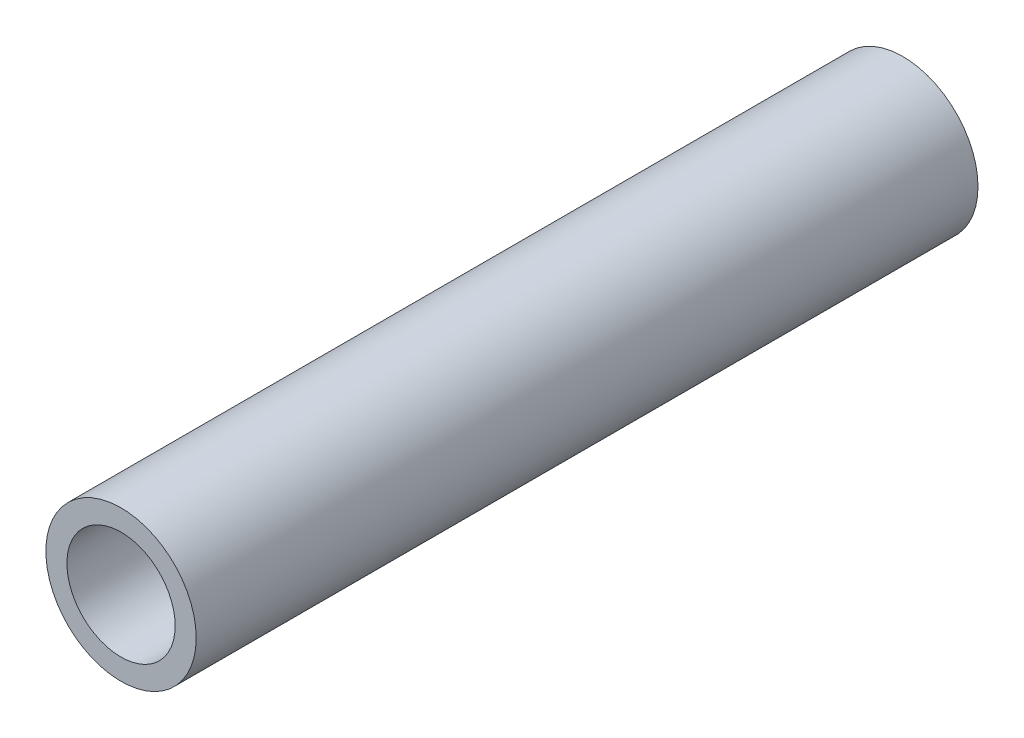
ISO-10303-21;
HEADER;
FILE_DESCRIPTION(('STEP AP214'),'2;1');
FILE_NAME('part.step','',(''),(''),'','','');
FILE_SCHEMA(('AUTOMOTIVE_DESIGN { 1 0 10303 214 1 1 1 1 }'));
ENDSEC;
DATA;
#1=APPLICATION_CONTEXT('core data for automotive mechanical design processes');
#2=APPLICATION_PROTOCOL_DEFINITION('international standard','automotive_design',2000,#1);
#3=PRODUCT_CONTEXT('',#1,'mechanical');
#4=PRODUCT('Part','Part','',(#3));
#5=PRODUCT_RELATED_PRODUCT_CATEGORY('part','',(#4));
#6=PRODUCT_DEFINITION_FORMATION('','',#4);
#7=PRODUCT_DEFINITION_CONTEXT('part definition',#1,'design');
#8=PRODUCT_DEFINITION('design','',#6,#7);
#9=PRODUCT_DEFINITION_SHAPE('','',#8);
#10=(LENGTH_UNIT() NAMED_UNIT(*) SI_UNIT(.MILLI.,.METRE.));
#11=(NAMED_UNIT(*) PLANE_ANGLE_UNIT() SI_UNIT($,.RADIAN.));
#12=(NAMED_UNIT(*) SI_UNIT($,.STERADIAN.) SOLID_ANGLE_UNIT());
#13=UNCERTAINTY_MEASURE_WITH_UNIT(LENGTH_MEASURE(1.E-05),#10,'distance_accuracy_value','');
#14=(GEOMETRIC_REPRESENTATION_CONTEXT(3) GLOBAL_UNCERTAINTY_ASSIGNED_CONTEXT((#13)) GLOBAL_UNIT_ASSIGNED_CONTEXT((#10,
#11,#12)) REPRESENTATION_CONTEXT('',''));
#15=CARTESIAN_POINT('',(0.,0.,0.));
#16=DIRECTION('',(0.,0.,1.));
#17=DIRECTION('',(1.,0.,0.));
#18=AXIS2_PLACEMENT_3D('',#15,#16,#17);
#19=CARTESIAN_POINT('',(0.,0.,65.));
#20=DIRECTION('',(0.,0.,1.));
#21=DIRECTION('',(1.,0.,0.));
#22=AXIS2_PLACEMENT_3D('',#19,#20,#21);
#23=PLANE('',#22);
#24=CARTESIAN_POINT('',(0.,0.,65.));
#25=DIRECTION('',(0.,0.,1.));
#26=DIRECTION('',(1.,0.,0.));
#27=AXIS2_PLACEMENT_3D('',#24,#25,#26);
#28=CIRCLE('',#27,6.25);
#29=CARTESIAN_POINT('',(6.25,0.,65.));
#30=VERTEX_POINT('',#29);
#31=EDGE_CURVE('E10',#30,#30,#28,.T.);
#32=ORIENTED_EDGE('',*,*,#31,.T.);
#33=EDGE_LOOP('',(#32));
#34=FACE_BOUND('',#33,.T.);
#35=CARTESIAN_POINT('',(0.,0.,65.));
#36=DIRECTION('',(0.,0.,1.));
#37=DIRECTION('',(1.,0.,0.));
#38=AXIS2_PLACEMENT_3D('',#35,#36,#37);
#39=CIRCLE('',#38,4.5);
#40=CARTESIAN_POINT('',(4.5,0.,65.));
#41=VERTEX_POINT('',#40);
#42=EDGE_CURVE('E42',#41,#41,#39,.T.);
#43=ORIENTED_EDGE('',*,*,#42,.F.);
#44=EDGE_LOOP('',(#43));
#45=FACE_BOUND('',#44,.T.);
#46=ADVANCED_FACE('F31',(#34,#45),#23,.T.);
#47=CARTESIAN_POINT('',(0.,0.,0.));
#48=DIRECTION('',(0.,0.,1.));
#49=DIRECTION('',(1.,0.,0.));
#50=AXIS2_PLACEMENT_3D('',#47,#48,#49);
#51=PLANE('',#50);
#52=CARTESIAN_POINT('',(0.,0.,0.));
#53=DIRECTION('',(0.,0.,1.));
#54=DIRECTION('',(1.,0.,0.));
#55=AXIS2_PLACEMENT_3D('',#52,#53,#54);
#56=CIRCLE('',#55,6.25);
#57=CARTESIAN_POINT('',(6.25,0.,0.));
#58=VERTEX_POINT('',#57);
#59=EDGE_CURVE('E35',#58,#58,#56,.T.);
#60=ORIENTED_EDGE('',*,*,#59,.F.);
#61=EDGE_LOOP('',(#60));
#62=FACE_BOUND('',#61,.T.);
#63=CARTESIAN_POINT('',(0.,0.,0.));
#64=DIRECTION('',(0.,0.,1.));
#65=DIRECTION('',(1.,0.,0.));
#66=AXIS2_PLACEMENT_3D('',#63,#64,#65);
#67=CIRCLE('',#66,4.5);
#68=CARTESIAN_POINT('',(4.5,0.,0.));
#69=VERTEX_POINT('',#68);
#70=EDGE_CURVE('E44',#69,#69,#67,.T.);
#71=ORIENTED_EDGE('',*,*,#70,.T.);
#72=EDGE_LOOP('',(#71));
#73=FACE_BOUND('',#72,.T.);
#74=ADVANCED_FACE('F54',(#62,#73),#51,.F.);
#75=CARTESIAN_POINT('',(0.,0.,65.));
#76=DIRECTION('',(0.,0.,-1.));
#77=DIRECTION('',(-1.,0.,0.));
#78=AXIS2_PLACEMENT_3D('',#75,#76,#77);
#79=CYLINDRICAL_SURFACE('',#78,6.25);
#80=ORIENTED_EDGE('',*,*,#31,.F.);
#81=EDGE_LOOP('',(#80));
#82=FACE_BOUND('',#81,.T.);
#83=ORIENTED_EDGE('',*,*,#59,.T.);
#84=EDGE_LOOP('',(#83));
#85=FACE_BOUND('',#84,.T.);
#86=ADVANCED_FACE('F33',(#82,#85),#79,.T.);
#87=CARTESIAN_POINT('',(0.,0.,65.));
#88=DIRECTION('',(0.,0.,-1.));
#89=DIRECTION('',(-1.,0.,0.));
#90=AXIS2_PLACEMENT_3D('',#87,#88,#89);
#91=CYLINDRICAL_SURFACE('',#90,4.5);
#92=ORIENTED_EDGE('',*,*,#42,.T.);
#93=EDGE_LOOP('',(#92));
#94=FACE_BOUND('',#93,.T.);
#95=ORIENTED_EDGE('',*,*,#70,.F.);
#96=EDGE_LOOP('',(#95));
#97=FACE_BOUND('',#96,.T.);
#98=ADVANCED_FACE('F50',(#94,#97),#91,.F.);
#99=CLOSED_SHELL('',(#46,#74,#86,#98));
#100=MANIFOLD_SOLID_BREP('B2',#99);
#101=ADVANCED_BREP_SHAPE_REPRESENTATION('',(#18,#100),#14);
#102=SHAPE_DEFINITION_REPRESENTATION(#9,#101);
ENDSEC;
END-ISO-10303-21;
